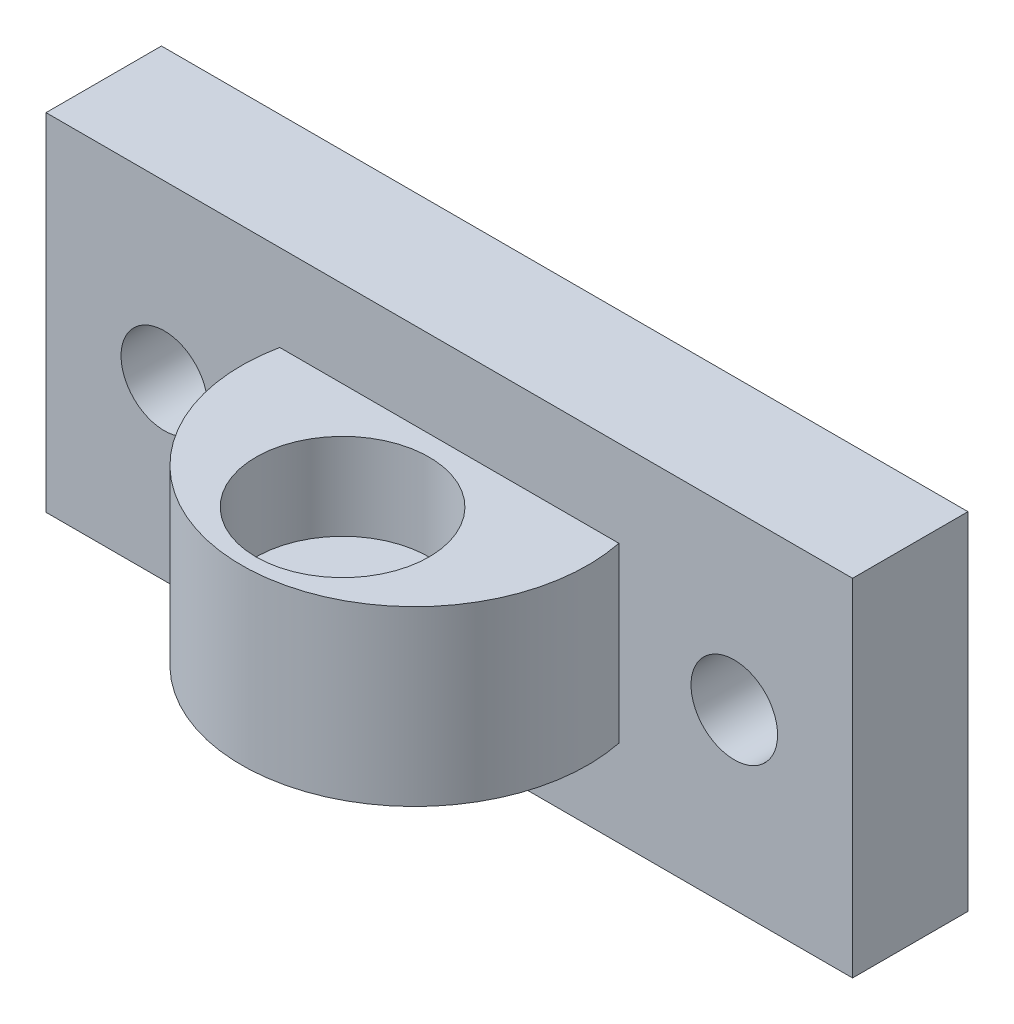
ISO-10303-21;
HEADER;
FILE_DESCRIPTION(('STEP AP214'),'2;1');
FILE_NAME('part.step','',(''),(''),'','','');
FILE_SCHEMA(('AUTOMOTIVE_DESIGN { 1 0 10303 214 1 1 1 1 }'));
ENDSEC;
DATA;
#1=APPLICATION_CONTEXT('core data for automotive mechanical design processes');
#2=APPLICATION_PROTOCOL_DEFINITION('international standard','automotive_design',2000,#1);
#3=PRODUCT_CONTEXT('',#1,'mechanical');
#4=PRODUCT('Part','Part','',(#3));
#5=PRODUCT_RELATED_PRODUCT_CATEGORY('part','',(#4));
#6=PRODUCT_DEFINITION_FORMATION('','',#4);
#7=PRODUCT_DEFINITION_CONTEXT('part definition',#1,'design');
#8=PRODUCT_DEFINITION('design','',#6,#7);
#9=PRODUCT_DEFINITION_SHAPE('','',#8);
#10=(LENGTH_UNIT() NAMED_UNIT(*) SI_UNIT(.MILLI.,.METRE.));
#11=(NAMED_UNIT(*) PLANE_ANGLE_UNIT() SI_UNIT($,.RADIAN.));
#12=(NAMED_UNIT(*) SI_UNIT($,.STERADIAN.) SOLID_ANGLE_UNIT());
#13=UNCERTAINTY_MEASURE_WITH_UNIT(LENGTH_MEASURE(1.E-05),#10,'distance_accuracy_value','');
#14=(GEOMETRIC_REPRESENTATION_CONTEXT(3) GLOBAL_UNCERTAINTY_ASSIGNED_CONTEXT((#13)) GLOBAL_UNIT_ASSIGNED_CONTEXT((#10,
#11,#12)) REPRESENTATION_CONTEXT('',''));
#15=CARTESIAN_POINT('',(0.,0.,0.));
#16=DIRECTION('',(0.,0.,1.));
#17=DIRECTION('',(1.,0.,0.));
#18=AXIS2_PLACEMENT_3D('',#15,#16,#17);
#19=CARTESIAN_POINT('',(-14.6740585431362,-12.,-1.2));
#20=DIRECTION('',(0.,0.,1.));
#21=DIRECTION('',(1.,0.,0.));
#22=AXIS2_PLACEMENT_3D('',#19,#20,#21);
#23=PLANE('',#22);
#24=CARTESIAN_POINT('',(9.87877538267963,-6.,-1.2));
#25=DIRECTION('',(0.,0.,-1.));
#26=DIRECTION('',(1.,0.,0.));
#27=AXIS2_PLACEMENT_3D('',#24,#25,#26);
#28=CIRCLE('',#27,1.5);
#29=CARTESIAN_POINT('',(11.3787753826796,-6.,-1.2));
#30=VERTEX_POINT('',#29);
#31=EDGE_CURVE('E11',#30,#30,#28,.T.);
#32=ORIENTED_EDGE('',*,*,#31,.T.);
#33=EDGE_LOOP('',(#32));
#34=FACE_BOUND('',#33,.T.);
#35=DIRECTION('',(0.,1.,0.));
#36=VECTOR('',#35,1.);
#37=CARTESIAN_POINT('',(-5.87877538267963,-12.,-1.2));
#38=LINE('',#37,#36);
#39=CARTESIAN_POINT('',(-5.87877538267963,-9.,-1.2));
#40=VERTEX_POINT('',#39);
#41=CARTESIAN_POINT('',(-5.87877538267963,-3.,-1.2));
#42=VERTEX_POINT('',#41);
#43=EDGE_CURVE('E23',#40,#42,#38,.T.);
#44=ORIENTED_EDGE('',*,*,#43,.T.);
#45=DIRECTION('',(1.,0.,0.));
#46=VECTOR('',#45,1.);
#47=CARTESIAN_POINT('',(0.,-3.,-1.2));
#48=LINE('',#47,#46);
#49=CARTESIAN_POINT('',(5.87877538267963,-3.,-1.2));
#50=VERTEX_POINT('',#49);
#51=EDGE_CURVE('E34',#42,#50,#48,.T.);
#52=ORIENTED_EDGE('',*,*,#51,.T.);
#53=DIRECTION('',(0.,1.,0.));
#54=VECTOR('',#53,1.);
#55=CARTESIAN_POINT('',(5.87877538267963,-12.,-1.2));
#56=LINE('',#55,#54);
#57=CARTESIAN_POINT('',(5.87877538267963,-9.,-1.2));
#58=VERTEX_POINT('',#57);
#59=EDGE_CURVE('E118',#58,#50,#56,.T.);
#60=ORIENTED_EDGE('',*,*,#59,.F.);
#61=DIRECTION('',(1.,0.,0.));
#62=VECTOR('',#61,1.);
#63=CARTESIAN_POINT('',(0.,-9.,-1.2));
#64=LINE('',#63,#62);
#65=EDGE_CURVE('E115',#40,#58,#64,.T.);
#66=ORIENTED_EDGE('',*,*,#65,.F.);
#67=EDGE_LOOP('',(#44,#52,#60,#66));
#68=FACE_BOUND('',#67,.T.);
#69=CARTESIAN_POINT('',(-9.87877538267963,-6.,-1.2));
#70=DIRECTION('',(0.,0.,1.));
#71=DIRECTION('',(1.,0.,0.));
#72=AXIS2_PLACEMENT_3D('',#69,#70,#71);
#73=CIRCLE('',#72,1.5);
#74=CARTESIAN_POINT('',(-8.37877538267963,-6.,-1.2));
#75=VERTEX_POINT('',#74);
#76=EDGE_CURVE('E112',#75,#75,#73,.T.);
#77=ORIENTED_EDGE('',*,*,#76,.F.);
#78=EDGE_LOOP('',(#77));
#79=FACE_BOUND('',#78,.T.);
#80=DIRECTION('',(1.,0.,0.));
#81=VECTOR('',#80,1.);
#82=CARTESIAN_POINT('',(14.6740585431362,-12.,-1.2));
#83=LINE('',#82,#81);
#84=CARTESIAN_POINT('',(-13.9787753826796,-12.,-1.2));
#85=VERTEX_POINT('',#84);
#86=CARTESIAN_POINT('',(13.9787753826796,-12.,-1.2));
#87=VERTEX_POINT('',#86);
#88=EDGE_CURVE('E110',#85,#87,#83,.T.);
#89=ORIENTED_EDGE('',*,*,#88,.T.);
#90=DIRECTION('',(0.,1.,0.));
#91=VECTOR('',#90,1.);
#92=CARTESIAN_POINT('',(13.9787753826796,-6.,-1.2));
#93=LINE('',#92,#91);
#94=CARTESIAN_POINT('',(13.9787753826796,0.,-1.2));
#95=VERTEX_POINT('',#94);
#96=EDGE_CURVE('E108',#87,#95,#93,.T.);
#97=ORIENTED_EDGE('',*,*,#96,.T.);
#98=DIRECTION('',(1.,0.,0.));
#99=VECTOR('',#98,1.);
#100=CARTESIAN_POINT('',(-14.6740585431362,0.,-1.2));
#101=LINE('',#100,#99);
#102=CARTESIAN_POINT('',(-13.9787753826796,0.,-1.2));
#103=VERTEX_POINT('',#102);
#104=EDGE_CURVE('E106',#103,#95,#101,.T.);
#105=ORIENTED_EDGE('',*,*,#104,.F.);
#106=DIRECTION('',(0.,1.,0.));
#107=VECTOR('',#106,1.);
#108=CARTESIAN_POINT('',(-13.9787753826796,-6.,-1.2));
#109=LINE('',#108,#107);
#110=EDGE_CURVE('E90',#85,#103,#109,.T.);
#111=ORIENTED_EDGE('',*,*,#110,.F.);
#112=EDGE_LOOP('',(#89,#97,#105,#111));
#113=FACE_BOUND('',#112,.T.);
#114=ADVANCED_FACE('F16',(#34,#68,#79,#113),#23,.T.);
#115=CARTESIAN_POINT('',(0.,-12.,0.4));
#116=DIRECTION('',(0.,-1.,0.));
#117=DIRECTION('',(1.,0.,0.));
#118=AXIS2_PLACEMENT_3D('',#115,#116,#117);
#119=PLANE('',#118);
#120=DIRECTION('',(1.,0.,0.));
#121=VECTOR('',#120,1.);
#122=CARTESIAN_POINT('',(0.,-12.,-5.2));
#123=LINE('',#122,#121);
#124=CARTESIAN_POINT('',(-13.9787753826796,-12.,-5.2));
#125=VERTEX_POINT('',#124);
#126=CARTESIAN_POINT('',(13.9787753826796,-12.,-5.2));
#127=VERTEX_POINT('',#126);
#128=EDGE_CURVE('E83',#125,#127,#123,.T.);
#129=ORIENTED_EDGE('',*,*,#128,.T.);
#130=DIRECTION('',(0.,0.,1.));
#131=VECTOR('',#130,1.);
#132=CARTESIAN_POINT('',(13.9787753826796,-12.,-26.2));
#133=LINE('',#132,#131);
#134=EDGE_CURVE('E101',#127,#87,#133,.T.);
#135=ORIENTED_EDGE('',*,*,#134,.T.);
#136=ORIENTED_EDGE('',*,*,#88,.F.);
#137=DIRECTION('',(0.,0.,1.));
#138=VECTOR('',#137,1.);
#139=CARTESIAN_POINT('',(-13.9787753826796,-12.,-26.2));
#140=LINE('',#139,#138);
#141=EDGE_CURVE('E99',#125,#85,#140,.T.);
#142=ORIENTED_EDGE('',*,*,#141,.F.);
#143=EDGE_LOOP('',(#129,#135,#136,#142));
#144=FACE_BOUND('',#143,.T.);
#145=ADVANCED_FACE('F148',(#144),#119,.T.);
#146=CARTESIAN_POINT('',(0.,0.,0.4));
#147=DIRECTION('',(0.,-1.,0.));
#148=DIRECTION('',(1.,0.,0.));
#149=AXIS2_PLACEMENT_3D('',#146,#147,#148);
#150=PLANE('',#149);
#151=DIRECTION('',(0.,0.,1.));
#152=VECTOR('',#151,1.);
#153=CARTESIAN_POINT('',(13.9787753826796,0.,-26.2));
#154=LINE('',#153,#152);
#155=CARTESIAN_POINT('',(13.9787753826796,0.,-5.2));
#156=VERTEX_POINT('',#155);
#157=EDGE_CURVE('E74',#156,#95,#154,.T.);
#158=ORIENTED_EDGE('',*,*,#157,.F.);
#159=DIRECTION('',(1.,0.,0.));
#160=VECTOR('',#159,1.);
#161=CARTESIAN_POINT('',(0.,0.,-5.2));
#162=LINE('',#161,#160);
#163=CARTESIAN_POINT('',(-13.9787753826796,0.,-5.2));
#164=VERTEX_POINT('',#163);
#165=EDGE_CURVE('E66',#164,#156,#162,.T.);
#166=ORIENTED_EDGE('',*,*,#165,.F.);
#167=DIRECTION('',(0.,0.,1.));
#168=VECTOR('',#167,1.);
#169=CARTESIAN_POINT('',(-13.9787753826796,0.,-26.2));
#170=LINE('',#169,#168);
#171=EDGE_CURVE('E71',#164,#103,#170,.T.);
#172=ORIENTED_EDGE('',*,*,#171,.T.);
#173=ORIENTED_EDGE('',*,*,#104,.T.);
#174=EDGE_LOOP('',(#158,#166,#172,#173));
#175=FACE_BOUND('',#174,.T.);
#176=ADVANCED_FACE('F68',(#175),#150,.F.);
#177=CARTESIAN_POINT('',(0.,-12.,-5.2));
#178=DIRECTION('',(0.,0.,1.));
#179=DIRECTION('',(1.,0.,0.));
#180=AXIS2_PLACEMENT_3D('',#177,#178,#179);
#181=PLANE('',#180);
#182=CARTESIAN_POINT('',(-9.87877538267963,-6.,-5.2));
#183=DIRECTION('',(0.,0.,1.));
#184=DIRECTION('',(1.,0.,0.));
#185=AXIS2_PLACEMENT_3D('',#182,#183,#184);
#186=CIRCLE('',#185,1.5);
#187=CARTESIAN_POINT('',(-8.37877538267963,-6.,-5.2));
#188=VERTEX_POINT('',#187);
#189=EDGE_CURVE('E91',#188,#188,#186,.T.);
#190=ORIENTED_EDGE('',*,*,#189,.T.);
#191=EDGE_LOOP('',(#190));
#192=FACE_BOUND('',#191,.T.);
#193=CARTESIAN_POINT('',(9.87877538267963,-6.,-5.2));
#194=DIRECTION('',(0.,0.,1.));
#195=DIRECTION('',(1.,0.,0.));
#196=AXIS2_PLACEMENT_3D('',#193,#194,#195);
#197=CIRCLE('',#196,1.5);
#198=CARTESIAN_POINT('',(11.3787753826796,-6.,-5.2));
#199=VERTEX_POINT('',#198);
#200=EDGE_CURVE('E94',#199,#199,#197,.F.);
#201=ORIENTED_EDGE('',*,*,#200,.F.);
#202=EDGE_LOOP('',(#201));
#203=FACE_BOUND('',#202,.T.);
#204=DIRECTION('',(0.,1.,0.));
#205=VECTOR('',#204,1.);
#206=CARTESIAN_POINT('',(13.9787753826796,-12.,-5.2));
#207=LINE('',#206,#205);
#208=EDGE_CURVE('E86',#127,#156,#207,.T.);
#209=ORIENTED_EDGE('',*,*,#208,.F.);
#210=ORIENTED_EDGE('',*,*,#128,.F.);
#211=DIRECTION('',(0.,1.,0.));
#212=VECTOR('',#211,1.);
#213=CARTESIAN_POINT('',(-13.9787753826796,-12.,-5.2));
#214=LINE('',#213,#212);
#215=EDGE_CURVE('E81',#125,#164,#214,.T.);
#216=ORIENTED_EDGE('',*,*,#215,.T.);
#217=ORIENTED_EDGE('',*,*,#165,.T.);
#218=EDGE_LOOP('',(#209,#210,#216,#217));
#219=FACE_BOUND('',#218,.T.);
#220=ADVANCED_FACE('F82',(#192,#203,#219),#181,.F.);
#221=CARTESIAN_POINT('',(0.,-12.,0.));
#222=DIRECTION('',(0.,1.,0.));
#223=DIRECTION('',(0.,0.,1.));
#224=AXIS2_PLACEMENT_3D('',#221,#222,#223);
#225=CYLINDRICAL_SURFACE('',#224,6.);
#226=ORIENTED_EDGE('',*,*,#59,.T.);
#227=CARTESIAN_POINT('',(0.,-3.,0.));
#228=DIRECTION('',(0.,-1.,0.));
#229=DIRECTION('',(0.,0.,-1.));
#230=AXIS2_PLACEMENT_3D('',#227,#228,#229);
#231=CIRCLE('',#230,6.);
#232=EDGE_CURVE('E87',#50,#42,#231,.T.);
#233=ORIENTED_EDGE('',*,*,#232,.T.);
#234=ORIENTED_EDGE('',*,*,#43,.F.);
#235=CARTESIAN_POINT('',(0.,-9.,0.));
#236=DIRECTION('',(0.,-1.,0.));
#237=DIRECTION('',(0.,0.,-1.));
#238=AXIS2_PLACEMENT_3D('',#235,#236,#237);
#239=CIRCLE('',#238,6.);
#240=EDGE_CURVE('E125',#58,#40,#239,.T.);
#241=ORIENTED_EDGE('',*,*,#240,.F.);
#242=EDGE_LOOP('',(#226,#233,#234,#241));
#243=FACE_BOUND('',#242,.T.);
#244=ADVANCED_FACE('F123',(#243),#225,.T.);
#245=CARTESIAN_POINT('',(0.,-9.,0.4));
#246=DIRECTION('',(0.,-1.,0.));
#247=DIRECTION('',(1.,0.,0.));
#248=AXIS2_PLACEMENT_3D('',#245,#246,#247);
#249=PLANE('',#248);
#250=ORIENTED_EDGE('',*,*,#240,.T.);
#251=ORIENTED_EDGE('',*,*,#65,.T.);
#252=EDGE_LOOP('',(#250,#251));
#253=FACE_BOUND('',#252,.T.);
#254=ADVANCED_FACE('F146',(#253),#249,.T.);
#255=CARTESIAN_POINT('',(0.,-3.,0.4));
#256=DIRECTION('',(0.,1.,0.));
#257=DIRECTION('',(-1.,0.,0.));
#258=AXIS2_PLACEMENT_3D('',#255,#256,#257);
#259=PLANE('',#258);
#260=CARTESIAN_POINT('',(0.,-3.,2.5));
#261=DIRECTION('',(0.,1.,0.));
#262=DIRECTION('',(0.,0.,1.));
#263=AXIS2_PLACEMENT_3D('',#260,#261,#262);
#264=CIRCLE('',#263,3.);
#265=CARTESIAN_POINT('',(0.,-3.,5.5));
#266=VERTEX_POINT('',#265);
#267=EDGE_CURVE('E129',#266,#266,#264,.T.);
#268=ORIENTED_EDGE('',*,*,#267,.F.);
#269=EDGE_LOOP('',(#268));
#270=FACE_BOUND('',#269,.T.);
#271=ORIENTED_EDGE('',*,*,#51,.F.);
#272=ORIENTED_EDGE('',*,*,#232,.F.);
#273=EDGE_LOOP('',(#271,#272));
#274=FACE_BOUND('',#273,.T.);
#275=ADVANCED_FACE('F127',(#270,#274),#259,.T.);
#276=CARTESIAN_POINT('',(0.,-6.,2.5));
#277=DIRECTION('',(0.,1.,0.));
#278=DIRECTION('',(0.,0.,1.));
#279=AXIS2_PLACEMENT_3D('',#276,#277,#278);
#280=CYLINDRICAL_SURFACE('',#279,3.);
#281=CARTESIAN_POINT('',(0.,-6.,2.5));
#282=DIRECTION('',(0.,1.,0.));
#283=DIRECTION('',(0.,0.,1.));
#284=AXIS2_PLACEMENT_3D('',#281,#282,#283);
#285=CIRCLE('',#284,3.);
#286=CARTESIAN_POINT('',(0.,-6.,5.5));
#287=VERTEX_POINT('',#286);
#288=EDGE_CURVE('E277',#287,#287,#285,.T.);
#289=ORIENTED_EDGE('',*,*,#288,.F.);
#290=EDGE_LOOP('',(#289));
#291=FACE_BOUND('',#290,.T.);
#292=ORIENTED_EDGE('',*,*,#267,.T.);
#293=EDGE_LOOP('',(#292));
#294=FACE_BOUND('',#293,.T.);
#295=ADVANCED_FACE('F183',(#291,#294),#280,.F.);
#296=CARTESIAN_POINT('',(0.,-6.,2.4));
#297=DIRECTION('',(0.,1.,0.));
#298=DIRECTION('',(-1.,0.,0.));
#299=AXIS2_PLACEMENT_3D('',#296,#297,#298);
#300=PLANE('',#299);
#301=ORIENTED_EDGE('',*,*,#288,.T.);
#302=EDGE_LOOP('',(#301));
#303=FACE_BOUND('',#302,.T.);
#304=ADVANCED_FACE('F179',(#303),#300,.T.);
#305=CARTESIAN_POINT('',(9.87877538267963,-6.,-26.2));
#306=DIRECTION('',(0.,0.,1.));
#307=DIRECTION('',(1.,0.,0.));
#308=AXIS2_PLACEMENT_3D('',#305,#306,#307);
#309=CYLINDRICAL_SURFACE('',#308,1.5);
#310=ORIENTED_EDGE('',*,*,#31,.F.);
#311=EDGE_LOOP('',(#310));
#312=FACE_BOUND('',#311,.T.);
#313=ORIENTED_EDGE('',*,*,#200,.T.);
#314=EDGE_LOOP('',(#313));
#315=FACE_BOUND('',#314,.T.);
#316=ADVANCED_FACE('F136',(#312,#315),#309,.F.);
#317=CARTESIAN_POINT('',(-9.87877538267963,-6.,-26.2));
#318=DIRECTION('',(0.,0.,1.));
#319=DIRECTION('',(1.,0.,0.));
#320=AXIS2_PLACEMENT_3D('',#317,#318,#319);
#321=CYLINDRICAL_SURFACE('',#320,1.5);
#322=ORIENTED_EDGE('',*,*,#76,.T.);
#323=EDGE_LOOP('',(#322));
#324=FACE_BOUND('',#323,.T.);
#325=ORIENTED_EDGE('',*,*,#189,.F.);
#326=EDGE_LOOP('',(#325));
#327=FACE_BOUND('',#326,.T.);
#328=ADVANCED_FACE('F171',(#324,#327),#321,.F.);
#329=CARTESIAN_POINT('',(-13.9787753826796,-6.,-26.2));
#330=DIRECTION('',(1.,0.,0.));
#331=DIRECTION('',(0.,1.,0.));
#332=AXIS2_PLACEMENT_3D('',#329,#330,#331);
#333=PLANE('',#332);
#334=ORIENTED_EDGE('',*,*,#141,.T.);
#335=ORIENTED_EDGE('',*,*,#110,.T.);
#336=ORIENTED_EDGE('',*,*,#171,.F.);
#337=ORIENTED_EDGE('',*,*,#215,.F.);
#338=EDGE_LOOP('',(#334,#335,#336,#337));
#339=FACE_BOUND('',#338,.T.);
#340=ADVANCED_FACE('F89',(#339),#333,.F.);
#341=CARTESIAN_POINT('',(13.9787753826796,-6.,-26.2));
#342=DIRECTION('',(1.,0.,0.));
#343=DIRECTION('',(0.,1.,0.));
#344=AXIS2_PLACEMENT_3D('',#341,#342,#343);
#345=PLANE('',#344);
#346=ORIENTED_EDGE('',*,*,#208,.T.);
#347=ORIENTED_EDGE('',*,*,#157,.T.);
#348=ORIENTED_EDGE('',*,*,#96,.F.);
#349=ORIENTED_EDGE('',*,*,#134,.F.);
#350=EDGE_LOOP('',(#346,#347,#348,#349));
#351=FACE_BOUND('',#350,.T.);
#352=ADVANCED_FACE('F165',(#351),#345,.T.);
#353=CLOSED_SHELL('',(#114,#145,#176,#220,#244,#254,#275,#295,#304,#316,#328,#340,#352));
#354=MANIFOLD_SOLID_BREP('B1',#353);
#355=ADVANCED_BREP_SHAPE_REPRESENTATION('',(#18,#354),#14);
#356=SHAPE_DEFINITION_REPRESENTATION(#9,#355);
ENDSEC;
END-ISO-10303-21;
